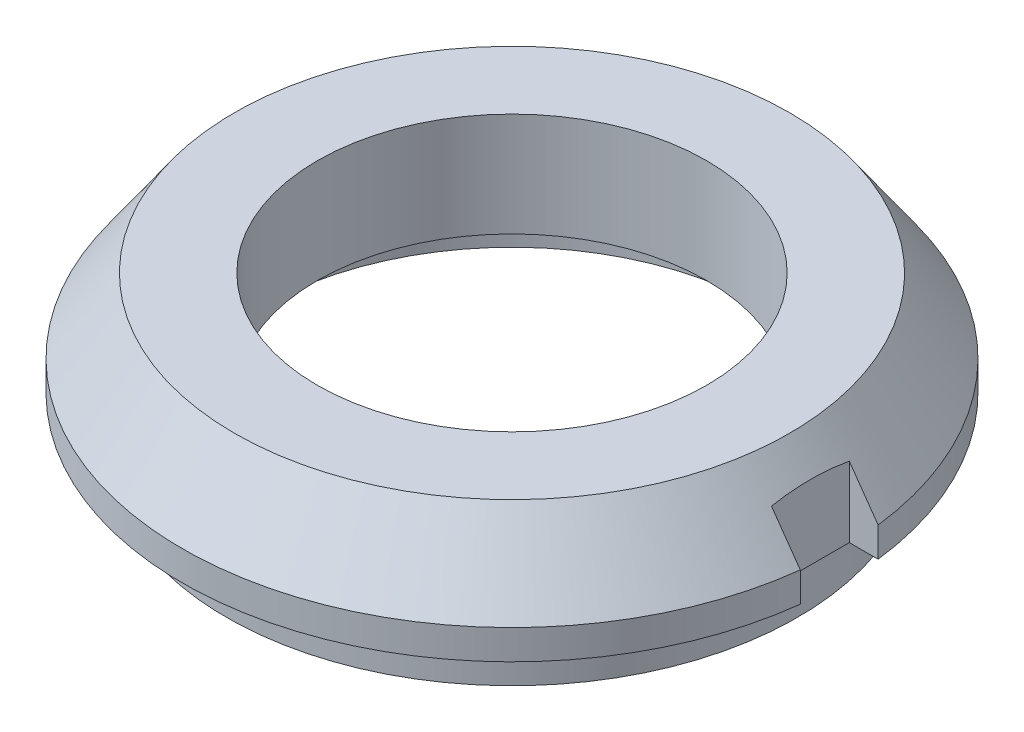
ISO-10303-21;
HEADER;
FILE_DESCRIPTION(('STEP AP214'),'2;1');
FILE_NAME('part.step','',(''),(''),'','','');
FILE_SCHEMA(('AUTOMOTIVE_DESIGN { 1 0 10303 214 1 1 1 1 }'));
ENDSEC;
DATA;
#1=APPLICATION_CONTEXT('core data for automotive mechanical design processes');
#2=APPLICATION_PROTOCOL_DEFINITION('international standard','automotive_design',2000,#1);
#3=PRODUCT_CONTEXT('',#1,'mechanical');
#4=PRODUCT('Part','Part','',(#3));
#5=PRODUCT_RELATED_PRODUCT_CATEGORY('part','',(#4));
#6=PRODUCT_DEFINITION_FORMATION('','',#4);
#7=PRODUCT_DEFINITION_CONTEXT('part definition',#1,'design');
#8=PRODUCT_DEFINITION('design','',#6,#7);
#9=PRODUCT_DEFINITION_SHAPE('','',#8);
#10=(LENGTH_UNIT() NAMED_UNIT(*) SI_UNIT(.MILLI.,.METRE.));
#11=(NAMED_UNIT(*) PLANE_ANGLE_UNIT() SI_UNIT($,.RADIAN.));
#12=(NAMED_UNIT(*) SI_UNIT($,.STERADIAN.) SOLID_ANGLE_UNIT());
#13=UNCERTAINTY_MEASURE_WITH_UNIT(LENGTH_MEASURE(1.E-05),#10,'distance_accuracy_value','');
#14=(GEOMETRIC_REPRESENTATION_CONTEXT(3) GLOBAL_UNCERTAINTY_ASSIGNED_CONTEXT((#13)) GLOBAL_UNIT_ASSIGNED_CONTEXT((#10,
#11,#12)) REPRESENTATION_CONTEXT('',''));
#15=CARTESIAN_POINT('',(0.,0.,0.));
#16=DIRECTION('',(0.,0.,1.));
#17=DIRECTION('',(1.,0.,0.));
#18=AXIS2_PLACEMENT_3D('',#15,#16,#17);
#19=CARTESIAN_POINT('',(0.,0.,0.));
#20=DIRECTION('',(0.,-1.,0.));
#21=DIRECTION('',(0.,0.,-1.));
#22=AXIS2_PLACEMENT_3D('',#19,#20,#21);
#23=CYLINDRICAL_SURFACE('',#22,12.7);
#24=CARTESIAN_POINT('',(0.,3.1437039865158,0.));
#25=DIRECTION('',(0.,-1.,0.));
#26=DIRECTION('',(0.,0.,-1.));
#27=AXIS2_PLACEMENT_3D('',#24,#25,#26);
#28=CIRCLE('',#27,12.7);
#29=CARTESIAN_POINT('',(-12.6111062163476,3.1437039865158,-1.5));
#30=VERTEX_POINT('',#29);
#31=CARTESIAN_POINT('',(12.6111062163476,3.1437039865158,-1.5));
#32=VERTEX_POINT('',#31);
#33=EDGE_CURVE('E230',#30,#32,#28,.T.);
#34=ORIENTED_EDGE('',*,*,#33,.T.);
#35=DIRECTION('',(0.,-1.,0.));
#36=VECTOR('',#35,1.);
#37=CARTESIAN_POINT('',(12.6111062163476,6.,-1.5));
#38=LINE('',#37,#36);
#39=CARTESIAN_POINT('',(12.6111062163476,2.,-1.5));
#40=VERTEX_POINT('',#39);
#41=EDGE_CURVE('E232',#32,#40,#38,.T.);
#42=ORIENTED_EDGE('',*,*,#41,.T.);
#43=CARTESIAN_POINT('',(0.,2.,0.));
#44=DIRECTION('',(0.,-1.,0.));
#45=DIRECTION('',(0.,0.,-1.));
#46=AXIS2_PLACEMENT_3D('',#43,#44,#45);
#47=CIRCLE('',#46,12.7);
#48=CARTESIAN_POINT('',(-12.6111062163476,2.,-1.5));
#49=VERTEX_POINT('',#48);
#50=EDGE_CURVE('E239',#49,#40,#47,.T.);
#51=ORIENTED_EDGE('',*,*,#50,.F.);
#52=DIRECTION('',(0.,-1.,0.));
#53=VECTOR('',#52,1.);
#54=CARTESIAN_POINT('',(-12.6111062163476,6.,-1.5));
#55=LINE('',#54,#53);
#56=EDGE_CURVE('E172',#30,#49,#55,.T.);
#57=ORIENTED_EDGE('',*,*,#56,.F.);
#58=EDGE_LOOP('',(#34,#42,#51,#57));
#59=FACE_BOUND('',#58,.T.);
#60=ADVANCED_FACE('F48',(#59),#23,.T.);
#61=CARTESIAN_POINT('',(0.,3.1437039865158,0.));
#62=DIRECTION('',(0.,-1.,0.));
#63=DIRECTION('',(0.,0.,-1.));
#64=AXIS2_PLACEMENT_3D('',#61,#62,#63);
#65=CONICAL_SURFACE('',#64,12.7,0.61086523819802);
#66=CARTESIAN_POINT('',(8.71930155160225,8.64580856401818,1.5));
#67=CARTESIAN_POINT('',(9.01503678715706,8.22955403382106,1.5));
#68=CARTESIAN_POINT('',(9.31049972115603,7.81310625233388,1.5));
#69=CARTESIAN_POINT('',(9.90099045107622,6.97990252734321,1.5));
#70=CARTESIAN_POINT('',(10.1960182471703,6.56314658396223,1.5));
#71=CARTESIAN_POINT('',(11.080612768889,5.31253452799822,1.5));
#72=CARTESIAN_POINT('',(11.66969133876,4.47833318799406,1.5));
#73=CARTESIAN_POINT('',(12.8470360584051,2.8093588393607,1.5));
#74=CARTESIAN_POINT('',(13.4353022089358,1.97458583126492,1.5));
#75=CARTESIAN_POINT('',(14.6112670019067,0.304638630112783,1.5));
#76=CARTESIAN_POINT('',(15.1989656436606,-0.530535563426858,1.5));
#77=CARTESIAN_POINT('',(15.7865020019929,-1.36582371112076,1.5));
#78=B_SPLINE_CURVE_WITH_KNOTS('',3,(#66,#67,#68,#69,#70,#71,#72,#73,#74,#75,#76,#77),
.UNSPECIFIED.,.F.,.F.,(4,2,2,2,2,4),(0.,1.5318431284838,3.06368564833022,6.1273670034552,
9.19104550377046,12.2547277041046),.UNSPECIFIED.);
#79=CARTESIAN_POINT('',(11.5,4.71836069197756,1.5));
#80=VERTEX_POINT('',#79);
#81=CARTESIAN_POINT('',(12.6111062163476,3.1437039865158,1.5));
#82=VERTEX_POINT('',#81);
#83=EDGE_CURVE('E124',#80,#82,#78,.T.);
#84=ORIENTED_EDGE('',*,*,#83,.F.);
#85=CARTESIAN_POINT('',(11.5,3.56892768957007,-4.64391354318703));
#86=CARTESIAN_POINT('',(11.5,3.71699253392864,-4.3669727931676));
#87=CARTESIAN_POINT('',(11.5,3.85640933601314,-4.08502379485567));
#88=CARTESIAN_POINT('',(11.5,4.1138093019548,-3.51036580472016));
#89=CARTESIAN_POINT('',(11.5,4.23171507029297,-3.21762234442898));
#90=CARTESIAN_POINT('',(11.5,4.43982888774234,-2.62548142835125));
#91=CARTESIAN_POINT('',(11.5,4.53029491793927,-2.32617625816734));
#92=CARTESIAN_POINT('',(11.5,4.68020785569036,-1.72020624485832));
#93=CARTESIAN_POINT('',(11.5,4.73970014134548,-1.41355286065124));
#94=CARTESIAN_POINT('',(11.5,4.81430764374084,-0.867244993862222));
#95=CARTESIAN_POINT('',(11.5,4.83651562925137,-0.628549392358888));
#96=CARTESIAN_POINT('',(11.5,4.85963108368953,-0.150067171071141));
#97=CARTESIAN_POINT('',(11.5,4.86053544038082,0.0897196030043803));
#98=CARTESIAN_POINT('',(11.5,4.84097009015226,0.568728586065164));
#99=CARTESIAN_POINT('',(11.5,4.82047189048172,0.807949616437883));
#100=CARTESIAN_POINT('',(11.5,4.75894551069298,1.28367088779186));
#101=CARTESIAN_POINT('',(11.5,4.7179193719521,1.52017139692039));
#102=CARTESIAN_POINT('',(11.5,4.60299147090769,2.05368333842945));
#103=CARTESIAN_POINT('',(11.5,4.52314638981535,2.34941522726649));
#104=CARTESIAN_POINT('',(11.5,4.33675688247403,2.93258796163595));
#105=CARTESIAN_POINT('',(11.5,4.23018009397359,3.2200182832449));
#106=CARTESIAN_POINT('',(11.5,3.99462828735818,3.78611703938229));
#107=CARTESIAN_POINT('',(11.5,3.86560696682178,4.06476592616506));
#108=CARTESIAN_POINT('',(11.5,3.58967866970254,4.61202415300154));
#109=CARTESIAN_POINT('',(11.5,3.44282838729327,4.88066194172425));
#110=CARTESIAN_POINT('',(11.5,3.28882508825271,5.1448330774917));
#111=B_SPLINE_CURVE_WITH_KNOTS('',3,(#85,#86,#87,#88,#89,#90,#91,#92,#93,#94,#95,#96,#97,#98,
#99,#100,#101,#102,#103,#104,#105,#106,#107,#108,#109,#110),.UNSPECIFIED.,.F.,.F.,(4,2,2,2,2,2,
2,2,2,2,2,2,4),(0.,0.94246916385754,1.88826513948548,2.8248717454964,3.76010228660615,
4.47839270624493,5.1967880599164,5.91614101836084,6.63542245578994,7.55286443638371,
8.47142250794347,9.39189851057687,10.3095206068163),.UNSPECIFIED.);
#112=CARTESIAN_POINT('',(11.5,4.71836069197756,-1.5));
#113=VERTEX_POINT('',#112);
#114=EDGE_CURVE('E112',#80,#113,#111,.F.);
#115=ORIENTED_EDGE('',*,*,#114,.T.);
#116=CARTESIAN_POINT('',(8.71930155160225,8.64580856401818,-1.5));
#117=CARTESIAN_POINT('',(9.01503678715706,8.22955403382106,-1.5));
#118=CARTESIAN_POINT('',(9.31049972115603,7.81310625233388,-1.5));
#119=CARTESIAN_POINT('',(9.90099045107622,6.97990252734321,-1.5));
#120=CARTESIAN_POINT('',(10.1960182471703,6.56314658396223,-1.5));
#121=CARTESIAN_POINT('',(11.080612768889,5.31253452799822,-1.5));
#122=CARTESIAN_POINT('',(11.66969133876,4.47833318799406,-1.5));
#123=CARTESIAN_POINT('',(12.8470360584051,2.8093588393607,-1.5));
#124=CARTESIAN_POINT('',(13.4353022089358,1.97458583126492,-1.5));
#125=CARTESIAN_POINT('',(14.6112670019067,0.304638630112786,-1.5));
#126=CARTESIAN_POINT('',(15.1989656436606,-0.530535563426854,-1.5));
#127=CARTESIAN_POINT('',(15.7865020019929,-1.36582371112076,-1.5));
#128=B_SPLINE_CURVE_WITH_KNOTS('',3,(#116,#117,#118,#119,#120,#121,#122,#123,#124,#125,#126,
#127),.UNSPECIFIED.,.F.,.F.,(4,2,2,2,2,4),(0.,1.5318431284838,3.06368564833022,6.1273670034552,
9.19104550377046,12.2547277041046),.UNSPECIFIED.);
#129=EDGE_CURVE('E119',#113,#32,#128,.T.);
#130=ORIENTED_EDGE('',*,*,#129,.T.);
#131=ORIENTED_EDGE('',*,*,#33,.F.);
#132=CARTESIAN_POINT('',(-15.7865020019929,-1.36582371112076,-1.5));
#133=CARTESIAN_POINT('',(-15.1989656436606,-0.530535563426856,-1.5));
#134=CARTESIAN_POINT('',(-14.6112670019067,0.304638630112784,-1.5));
#135=CARTESIAN_POINT('',(-13.4353022089358,1.97458583126492,-1.5));
#136=CARTESIAN_POINT('',(-12.8470360584051,2.8093588393607,-1.5));
#137=CARTESIAN_POINT('',(-11.66969133876,4.47833318799406,-1.5));
#138=CARTESIAN_POINT('',(-11.080612768889,5.31253452799822,-1.5));
#139=CARTESIAN_POINT('',(-10.1960182471703,6.56314658396223,-1.5));
#140=CARTESIAN_POINT('',(-9.90099045107622,6.97990252734321,-1.5));
#141=CARTESIAN_POINT('',(-9.31049972115603,7.81310625233388,-1.5));
#142=CARTESIAN_POINT('',(-9.01503678715706,8.22955403382106,-1.5));
#143=CARTESIAN_POINT('',(-8.71930155160225,8.64580856401818,-1.5));
#144=B_SPLINE_CURVE_WITH_KNOTS('',3,(#132,#133,#134,#135,#136,#137,#138,#139,#140,#141,#142,
#143),.UNSPECIFIED.,.F.,.F.,(4,2,2,2,2,4),(0.,3.06368220033417,6.12736070064943,
9.19104205577441,10.7228845756208,12.2547277041046),.UNSPECIFIED.);
#145=CARTESIAN_POINT('',(-11.5,4.71836069197756,-1.5));
#146=VERTEX_POINT('',#145);
#147=EDGE_CURVE('E179',#30,#146,#144,.T.);
#148=ORIENTED_EDGE('',*,*,#147,.T.);
#149=CARTESIAN_POINT('',(-11.5,3.56892768957007,-4.64391354318703));
#150=CARTESIAN_POINT('',(-11.5,3.71699253392864,-4.3669727931676));
#151=CARTESIAN_POINT('',(-11.5,3.85640933601314,-4.08502379485566));
#152=CARTESIAN_POINT('',(-11.5,4.1138093019548,-3.51036580472016));
#153=CARTESIAN_POINT('',(-11.5,4.23171507029297,-3.21762234442898));
#154=CARTESIAN_POINT('',(-11.5,4.43982888774234,-2.62548142835124));
#155=CARTESIAN_POINT('',(-11.5,4.53029491793927,-2.32617625816734));
#156=CARTESIAN_POINT('',(-11.5,4.68020785569036,-1.72020624485832));
#157=CARTESIAN_POINT('',(-11.5,4.73970014134548,-1.41355286065124));
#158=CARTESIAN_POINT('',(-11.5,4.81430764374084,-0.86724499386222));
#159=CARTESIAN_POINT('',(-11.5,4.83651562925137,-0.628549392358885));
#160=CARTESIAN_POINT('',(-11.5,4.85963108368953,-0.150067171071138));
#161=CARTESIAN_POINT('',(-11.5,4.86053544038082,0.0897196030043831));
#162=CARTESIAN_POINT('',(-11.5,4.84097009015226,0.568728586065166));
#163=CARTESIAN_POINT('',(-11.5,4.82047189048172,0.807949616437885));
#164=CARTESIAN_POINT('',(-11.5,4.75894551069298,1.28367088779186));
#165=CARTESIAN_POINT('',(-11.5,4.71791937195209,1.52017139692039));
#166=CARTESIAN_POINT('',(-11.5,4.60299147090769,2.05368333842946));
#167=CARTESIAN_POINT('',(-11.5,4.52314638981535,2.34941522726649));
#168=CARTESIAN_POINT('',(-11.5,4.33675688247403,2.93258796163596));
#169=CARTESIAN_POINT('',(-11.5,4.23018009397359,3.2200182832449));
#170=CARTESIAN_POINT('',(-11.5,3.99462828735818,3.78611703938229));
#171=CARTESIAN_POINT('',(-11.5,3.86560696682178,4.06476592616506));
#172=CARTESIAN_POINT('',(-11.5,3.58967866970253,4.61202415300154));
#173=CARTESIAN_POINT('',(-11.5,3.44282838729327,4.88066194172426));
#174=CARTESIAN_POINT('',(-11.5,3.28882508825271,5.1448330774917));
#175=B_SPLINE_CURVE_WITH_KNOTS('',3,(#149,#150,#151,#152,#153,#154,#155,#156,#157,#158,#159,
#160,#161,#162,#163,#164,#165,#166,#167,#168,#169,#170,#171,#172,#173,#174),.UNSPECIFIED.,.F.,
.F.,(4,2,2,2,2,2,2,2,2,2,2,2,4),(0.,0.942469163857541,1.88826513948548,2.8248717454964,
3.76010228660615,4.47839270624493,5.1967880599164,5.91614101836084,6.63542245578994,
7.55286443638372,8.47142250794347,9.39189851057687,10.3095206068163),.UNSPECIFIED.);
#176=CARTESIAN_POINT('',(-11.5,4.71836069197756,1.5));
#177=VERTEX_POINT('',#176);
#178=EDGE_CURVE('E164',#177,#146,#175,.F.);
#179=ORIENTED_EDGE('',*,*,#178,.F.);
#180=CARTESIAN_POINT('',(-15.7865020019929,-1.36582371112076,1.5));
#181=CARTESIAN_POINT('',(-15.1989656436606,-0.530535563426858,1.5));
#182=CARTESIAN_POINT('',(-14.6112670019067,0.304638630112783,1.5));
#183=CARTESIAN_POINT('',(-13.4353022089358,1.97458583126492,1.5));
#184=CARTESIAN_POINT('',(-12.8470360584051,2.8093588393607,1.5));
#185=CARTESIAN_POINT('',(-11.66969133876,4.47833318799406,1.5));
#186=CARTESIAN_POINT('',(-11.080612768889,5.31253452799822,1.5));
#187=CARTESIAN_POINT('',(-10.1960182471703,6.56314658396223,1.5));
#188=CARTESIAN_POINT('',(-9.90099045107622,6.97990252734321,1.5));
#189=CARTESIAN_POINT('',(-9.31049972115603,7.81310625233388,1.5));
#190=CARTESIAN_POINT('',(-9.01503678715706,8.22955403382106,1.5));
#191=CARTESIAN_POINT('',(-8.71930155160225,8.64580856401818,1.5));
#192=B_SPLINE_CURVE_WITH_KNOTS('',3,(#180,#181,#182,#183,#184,#185,#186,#187,#188,#189,#190,
#191),.UNSPECIFIED.,.F.,.F.,(4,2,2,2,2,4),(0.,3.06368220033417,6.12736070064943,
9.19104205577441,10.7228845756208,12.2547277041046),.UNSPECIFIED.);
#193=CARTESIAN_POINT('',(-12.6111062163476,3.1437039865158,1.5));
#194=VERTEX_POINT('',#193);
#195=EDGE_CURVE('E171',#194,#177,#192,.T.);
#196=ORIENTED_EDGE('',*,*,#195,.F.);
#197=EDGE_CURVE('E132',#82,#194,#28,.T.);
#198=ORIENTED_EDGE('',*,*,#197,.F.);
#199=EDGE_LOOP('',(#84,#115,#130,#131,#148,#179,#196,#198));
#200=FACE_BOUND('',#199,.T.);
#201=CARTESIAN_POINT('',(0.,6.,0.));
#202=DIRECTION('',(0.,-1.,0.));
#203=DIRECTION('',(0.,0.,-1.));
#204=AXIS2_PLACEMENT_3D('',#201,#202,#203);
#205=CIRCLE('',#204,10.7);
#206=CARTESIAN_POINT('',(0.,6.,-10.7));
#207=VERTEX_POINT('',#206);
#208=EDGE_CURVE('E234',#207,#207,#205,.T.);
#209=ORIENTED_EDGE('',*,*,#208,.T.);
#210=EDGE_LOOP('',(#209));
#211=FACE_BOUND('',#210,.T.);
#212=ADVANCED_FACE('F129',(#200,#211),#65,.T.);
#213=DIRECTION('',(0.,-1.,0.));
#214=VECTOR('',#213,1.);
#215=CARTESIAN_POINT('',(12.6111062163476,6.,1.5));
#216=LINE('',#215,#214);
#217=CARTESIAN_POINT('',(12.6111062163476,2.,1.5));
#218=VERTEX_POINT('',#217);
#219=EDGE_CURVE('E120',#82,#218,#216,.T.);
#220=ORIENTED_EDGE('',*,*,#219,.F.);
#221=ORIENTED_EDGE('',*,*,#197,.T.);
#222=DIRECTION('',(0.,-1.,0.));
#223=VECTOR('',#222,1.);
#224=CARTESIAN_POINT('',(-12.6111062163476,6.,1.5));
#225=LINE('',#224,#223);
#226=CARTESIAN_POINT('',(-12.6111062163476,2.,1.5));
#227=VERTEX_POINT('',#226);
#228=EDGE_CURVE('E451',#194,#227,#225,.T.);
#229=ORIENTED_EDGE('',*,*,#228,.T.);
#230=EDGE_CURVE('E255',#218,#227,#47,.T.);
#231=ORIENTED_EDGE('',*,*,#230,.F.);
#232=EDGE_LOOP('',(#220,#221,#229,#231));
#233=FACE_BOUND('',#232,.T.);
#234=ADVANCED_FACE('F215',(#233),#23,.T.);
#235=CARTESIAN_POINT('',(0.,2.,0.));
#236=DIRECTION('',(0.,1.,0.));
#237=DIRECTION('',(0.,0.,1.));
#238=AXIS2_PLACEMENT_3D('',#235,#236,#237);
#239=PLANE('',#238);
#240=DIRECTION('',(0.,0.,-1.));
#241=VECTOR('',#240,1.);
#242=CARTESIAN_POINT('',(11.5,2.,0.));
#243=LINE('',#242,#241);
#244=CARTESIAN_POINT('',(11.5,2.,1.5));
#245=VERTEX_POINT('',#244);
#246=CARTESIAN_POINT('',(11.5,2.,-1.5));
#247=VERTEX_POINT('',#246);
#248=EDGE_CURVE('E250',#245,#247,#243,.T.);
#249=ORIENTED_EDGE('',*,*,#248,.F.);
#250=DIRECTION('',(1.,0.,0.));
#251=VECTOR('',#250,1.);
#252=CARTESIAN_POINT('',(0.,2.,1.5));
#253=LINE('',#252,#251);
#254=EDGE_CURVE('E13',#245,#218,#253,.T.);
#255=ORIENTED_EDGE('',*,*,#254,.T.);
#256=ORIENTED_EDGE('',*,*,#230,.T.);
#257=DIRECTION('',(1.,0.,0.));
#258=VECTOR('',#257,1.);
#259=CARTESIAN_POINT('',(0.,2.,1.5));
#260=LINE('',#259,#258);
#261=CARTESIAN_POINT('',(-11.5,2.,1.5));
#262=VERTEX_POINT('',#261);
#263=EDGE_CURVE('E245',#227,#262,#260,.T.);
#264=ORIENTED_EDGE('',*,*,#263,.T.);
#265=DIRECTION('',(0.,0.,-1.));
#266=VECTOR('',#265,1.);
#267=CARTESIAN_POINT('',(-11.5,2.,0.));
#268=LINE('',#267,#266);
#269=CARTESIAN_POINT('',(-11.5,2.,-1.5));
#270=VERTEX_POINT('',#269);
#271=EDGE_CURVE('E237',#262,#270,#268,.T.);
#272=ORIENTED_EDGE('',*,*,#271,.T.);
#273=DIRECTION('',(1.,0.,0.));
#274=VECTOR('',#273,1.);
#275=CARTESIAN_POINT('',(0.,2.,-1.5));
#276=LINE('',#275,#274);
#277=EDGE_CURVE('E248',#49,#270,#276,.T.);
#278=ORIENTED_EDGE('',*,*,#277,.F.);
#279=ORIENTED_EDGE('',*,*,#50,.T.);
#280=DIRECTION('',(1.,0.,0.));
#281=VECTOR('',#280,1.);
#282=CARTESIAN_POINT('',(0.,2.,-1.5));
#283=LINE('',#282,#281);
#284=EDGE_CURVE('E56',#247,#40,#283,.T.);
#285=ORIENTED_EDGE('',*,*,#284,.F.);
#286=EDGE_LOOP('',(#249,#255,#256,#264,#272,#278,#279,#285));
#287=FACE_BOUND('',#286,.T.);
#288=CARTESIAN_POINT('',(0.,2.,0.));
#289=DIRECTION('',(0.,-1.,0.));
#290=DIRECTION('',(0.,0.,-1.));
#291=AXIS2_PLACEMENT_3D('',#288,#289,#290);
#292=CIRCLE('',#291,11.);
#293=CARTESIAN_POINT('',(0.,2.,-11.));
#294=VERTEX_POINT('',#293);
#295=EDGE_CURVE('E256',#294,#294,#292,.T.);
#296=ORIENTED_EDGE('',*,*,#295,.F.);
#297=EDGE_LOOP('',(#296));
#298=FACE_BOUND('',#297,.T.);
#299=ADVANCED_FACE('F213',(#287,#298),#239,.F.);
#300=CARTESIAN_POINT('',(0.,6.,0.));
#301=DIRECTION('',(0.,1.,0.));
#302=DIRECTION('',(0.,0.,1.));
#303=AXIS2_PLACEMENT_3D('',#300,#301,#302);
#304=PLANE('',#303);
#305=CARTESIAN_POINT('',(0.,6.,0.));
#306=DIRECTION('',(0.,-1.,0.));
#307=DIRECTION('',(0.,0.,-1.));
#308=AXIS2_PLACEMENT_3D('',#305,#306,#307);
#309=CIRCLE('',#308,7.5);
#310=CARTESIAN_POINT('',(0.,6.,-7.5));
#311=VERTEX_POINT('',#310);
#312=EDGE_CURVE('E186',#311,#311,#309,.T.);
#313=ORIENTED_EDGE('',*,*,#312,.T.);
#314=EDGE_LOOP('',(#313));
#315=FACE_BOUND('',#314,.T.);
#316=ORIENTED_EDGE('',*,*,#208,.F.);
#317=EDGE_LOOP('',(#316));
#318=FACE_BOUND('',#317,.T.);
#319=ADVANCED_FACE('F50',(#315,#318),#304,.T.);
#320=CARTESIAN_POINT('',(0.,0.,0.));
#321=DIRECTION('',(0.,-1.,0.));
#322=DIRECTION('',(0.,0.,-1.));
#323=AXIS2_PLACEMENT_3D('',#320,#321,#322);
#324=CYLINDRICAL_SURFACE('',#323,11.);
#325=CARTESIAN_POINT('',(0.,0.,0.));
#326=DIRECTION('',(0.,-1.,0.));
#327=DIRECTION('',(0.,0.,-1.));
#328=AXIS2_PLACEMENT_3D('',#325,#326,#327);
#329=CIRCLE('',#328,11.);
#330=CARTESIAN_POINT('',(0.,0.,-11.));
#331=VERTEX_POINT('',#330);
#332=EDGE_CURVE('E260',#331,#331,#329,.T.);
#333=ORIENTED_EDGE('',*,*,#332,.F.);
#334=EDGE_LOOP('',(#333));
#335=FACE_BOUND('',#334,.T.);
#336=ORIENTED_EDGE('',*,*,#295,.T.);
#337=EDGE_LOOP('',(#336));
#338=FACE_BOUND('',#337,.T.);
#339=ADVANCED_FACE('F208',(#335,#338),#324,.T.);
#340=CARTESIAN_POINT('',(0.,0.,0.));
#341=DIRECTION('',(0.,1.,0.));
#342=DIRECTION('',(0.,0.,1.));
#343=AXIS2_PLACEMENT_3D('',#340,#341,#342);
#344=PLANE('',#343);
#345=CARTESIAN_POINT('',(0.,0.,0.));
#346=DIRECTION('',(0.,-1.,0.));
#347=DIRECTION('',(0.,0.,-1.));
#348=AXIS2_PLACEMENT_3D('',#345,#346,#347);
#349=CIRCLE('',#348,9.7);
#350=CARTESIAN_POINT('',(0.,0.,-9.7));
#351=VERTEX_POINT('',#350);
#352=EDGE_CURVE('E264',#351,#351,#349,.T.);
#353=ORIENTED_EDGE('',*,*,#352,.F.);
#354=EDGE_LOOP('',(#353));
#355=FACE_BOUND('',#354,.T.);
#356=ORIENTED_EDGE('',*,*,#332,.T.);
#357=EDGE_LOOP('',(#356));
#358=FACE_BOUND('',#357,.T.);
#359=ADVANCED_FACE('F204',(#355,#358),#344,.F.);
#360=CARTESIAN_POINT('',(0.,0.,0.));
#361=DIRECTION('',(0.,-1.,0.));
#362=DIRECTION('',(0.,0.,-1.));
#363=AXIS2_PLACEMENT_3D('',#360,#361,#362);
#364=CYLINDRICAL_SURFACE('',#363,9.7);
#365=CARTESIAN_POINT('',(0.,2.,0.));
#366=DIRECTION('',(0.,-1.,0.));
#367=DIRECTION('',(0.,0.,-1.));
#368=AXIS2_PLACEMENT_3D('',#365,#366,#367);
#369=CIRCLE('',#368,9.7);
#370=CARTESIAN_POINT('',(0.,2.,-9.7));
#371=VERTEX_POINT('',#370);
#372=EDGE_CURVE('E269',#371,#371,#369,.T.);
#373=ORIENTED_EDGE('',*,*,#372,.F.);
#374=EDGE_LOOP('',(#373));
#375=FACE_BOUND('',#374,.T.);
#376=ORIENTED_EDGE('',*,*,#352,.T.);
#377=EDGE_LOOP('',(#376));
#378=FACE_BOUND('',#377,.T.);
#379=ADVANCED_FACE('F200',(#375,#378),#364,.F.);
#380=CARTESIAN_POINT('',(0.,2.,0.));
#381=DIRECTION('',(0.,-1.,0.));
#382=DIRECTION('',(0.,0.,-1.));
#383=AXIS2_PLACEMENT_3D('',#380,#381,#382);
#384=PLANE('',#383);
#385=ORIENTED_EDGE('',*,*,#372,.T.);
#386=EDGE_LOOP('',(#385));
#387=FACE_BOUND('',#386,.T.);
#388=CARTESIAN_POINT('',(0.,2.,0.));
#389=DIRECTION('',(0.,-1.,0.));
#390=DIRECTION('',(0.,0.,-1.));
#391=AXIS2_PLACEMENT_3D('',#388,#389,#390);
#392=CIRCLE('',#391,7.5);
#393=CARTESIAN_POINT('',(0.,2.,-7.5));
#394=VERTEX_POINT('',#393);
#395=EDGE_CURVE('E271',#394,#394,#392,.T.);
#396=ORIENTED_EDGE('',*,*,#395,.F.);
#397=EDGE_LOOP('',(#396));
#398=FACE_BOUND('',#397,.T.);
#399=ADVANCED_FACE('F196',(#387,#398),#384,.T.);
#400=CARTESIAN_POINT('',(0.,0.,0.));
#401=DIRECTION('',(0.,-1.,0.));
#402=DIRECTION('',(0.,0.,-1.));
#403=AXIS2_PLACEMENT_3D('',#400,#401,#402);
#404=CYLINDRICAL_SURFACE('',#403,7.5);
#405=ORIENTED_EDGE('',*,*,#312,.F.);
#406=EDGE_LOOP('',(#405));
#407=FACE_BOUND('',#406,.T.);
#408=ORIENTED_EDGE('',*,*,#395,.T.);
#409=EDGE_LOOP('',(#408));
#410=FACE_BOUND('',#409,.T.);
#411=ADVANCED_FACE('F192',(#407,#410),#404,.F.);
#412=CARTESIAN_POINT('',(0.,6.,-1.5));
#413=DIRECTION('',(0.,0.,1.));
#414=DIRECTION('',(1.,0.,0.));
#415=AXIS2_PLACEMENT_3D('',#412,#413,#414);
#416=PLANE('',#415);
#417=ORIENTED_EDGE('',*,*,#56,.T.);
#418=ORIENTED_EDGE('',*,*,#277,.T.);
#419=DIRECTION('',(0.,-1.,0.));
#420=VECTOR('',#419,1.);
#421=CARTESIAN_POINT('',(-11.5,6.,-1.5));
#422=LINE('',#421,#420);
#423=EDGE_CURVE('E71',#146,#270,#422,.T.);
#424=ORIENTED_EDGE('',*,*,#423,.F.);
#425=ORIENTED_EDGE('',*,*,#147,.F.);
#426=EDGE_LOOP('',(#417,#418,#424,#425));
#427=FACE_BOUND('',#426,.T.);
#428=ADVANCED_FACE('F188',(#427),#416,.T.);
#429=CARTESIAN_POINT('',(0.,6.,1.5));
#430=DIRECTION('',(0.,0.,1.));
#431=DIRECTION('',(1.,0.,0.));
#432=AXIS2_PLACEMENT_3D('',#429,#430,#431);
#433=PLANE('',#432);
#434=ORIENTED_EDGE('',*,*,#195,.T.);
#435=DIRECTION('',(0.,-1.,0.));
#436=VECTOR('',#435,1.);
#437=CARTESIAN_POINT('',(-11.5,6.,1.5));
#438=LINE('',#437,#436);
#439=EDGE_CURVE('E134',#177,#262,#438,.T.);
#440=ORIENTED_EDGE('',*,*,#439,.T.);
#441=ORIENTED_EDGE('',*,*,#263,.F.);
#442=ORIENTED_EDGE('',*,*,#228,.F.);
#443=EDGE_LOOP('',(#434,#440,#441,#442));
#444=FACE_BOUND('',#443,.T.);
#445=ADVANCED_FACE('F160',(#444),#433,.F.);
#446=CARTESIAN_POINT('',(-11.5,6.,0.));
#447=DIRECTION('',(1.,0.,0.));
#448=DIRECTION('',(0.,0.,-1.));
#449=AXIS2_PLACEMENT_3D('',#446,#447,#448);
#450=PLANE('',#449);
#451=ORIENTED_EDGE('',*,*,#178,.T.);
#452=ORIENTED_EDGE('',*,*,#423,.T.);
#453=ORIENTED_EDGE('',*,*,#271,.F.);
#454=ORIENTED_EDGE('',*,*,#439,.F.);
#455=EDGE_LOOP('',(#451,#452,#453,#454));
#456=FACE_BOUND('',#455,.T.);
#457=ADVANCED_FACE('F154',(#456),#450,.F.);
#458=CARTESIAN_POINT('',(0.,6.,1.5));
#459=DIRECTION('',(0.,0.,1.));
#460=DIRECTION('',(1.,0.,0.));
#461=AXIS2_PLACEMENT_3D('',#458,#459,#460);
#462=PLANE('',#461);
#463=ORIENTED_EDGE('',*,*,#83,.T.);
#464=ORIENTED_EDGE('',*,*,#219,.T.);
#465=ORIENTED_EDGE('',*,*,#254,.F.);
#466=DIRECTION('',(0.,-1.,0.));
#467=VECTOR('',#466,1.);
#468=CARTESIAN_POINT('',(11.5,6.,1.5));
#469=LINE('',#468,#467);
#470=EDGE_CURVE('E63',#80,#245,#469,.T.);
#471=ORIENTED_EDGE('',*,*,#470,.F.);
#472=EDGE_LOOP('',(#463,#464,#465,#471));
#473=FACE_BOUND('',#472,.T.);
#474=ADVANCED_FACE('F123',(#473),#462,.F.);
#475=CARTESIAN_POINT('',(0.,6.,-1.5));
#476=DIRECTION('',(0.,0.,1.));
#477=DIRECTION('',(1.,0.,0.));
#478=AXIS2_PLACEMENT_3D('',#475,#476,#477);
#479=PLANE('',#478);
#480=DIRECTION('',(0.,-1.,0.));
#481=VECTOR('',#480,1.);
#482=CARTESIAN_POINT('',(11.5,6.,-1.5));
#483=LINE('',#482,#481);
#484=EDGE_CURVE('E115',#113,#247,#483,.T.);
#485=ORIENTED_EDGE('',*,*,#484,.T.);
#486=ORIENTED_EDGE('',*,*,#284,.T.);
#487=ORIENTED_EDGE('',*,*,#41,.F.);
#488=ORIENTED_EDGE('',*,*,#129,.F.);
#489=EDGE_LOOP('',(#485,#486,#487,#488));
#490=FACE_BOUND('',#489,.T.);
#491=ADVANCED_FACE('F153',(#490),#479,.T.);
#492=CARTESIAN_POINT('',(11.5,6.,0.));
#493=DIRECTION('',(1.,0.,0.));
#494=DIRECTION('',(0.,0.,-1.));
#495=AXIS2_PLACEMENT_3D('',#492,#493,#494);
#496=PLANE('',#495);
#497=ORIENTED_EDGE('',*,*,#470,.T.);
#498=ORIENTED_EDGE('',*,*,#248,.T.);
#499=ORIENTED_EDGE('',*,*,#484,.F.);
#500=ORIENTED_EDGE('',*,*,#114,.F.);
#501=EDGE_LOOP('',(#497,#498,#499,#500));
#502=FACE_BOUND('',#501,.T.);
#503=ADVANCED_FACE('F113',(#502),#496,.T.);
#504=CLOSED_SHELL('',(#60,#212,#234,#299,#319,#339,#359,#379,#399,#411,#428,#445,#457,#474,#491,#503));
#505=MANIFOLD_SOLID_BREP('B2',#504);
#506=ADVANCED_BREP_SHAPE_REPRESENTATION('',(#18,#505),#14);
#507=SHAPE_DEFINITION_REPRESENTATION(#9,#506);
ENDSEC;
END-ISO-10303-21;
